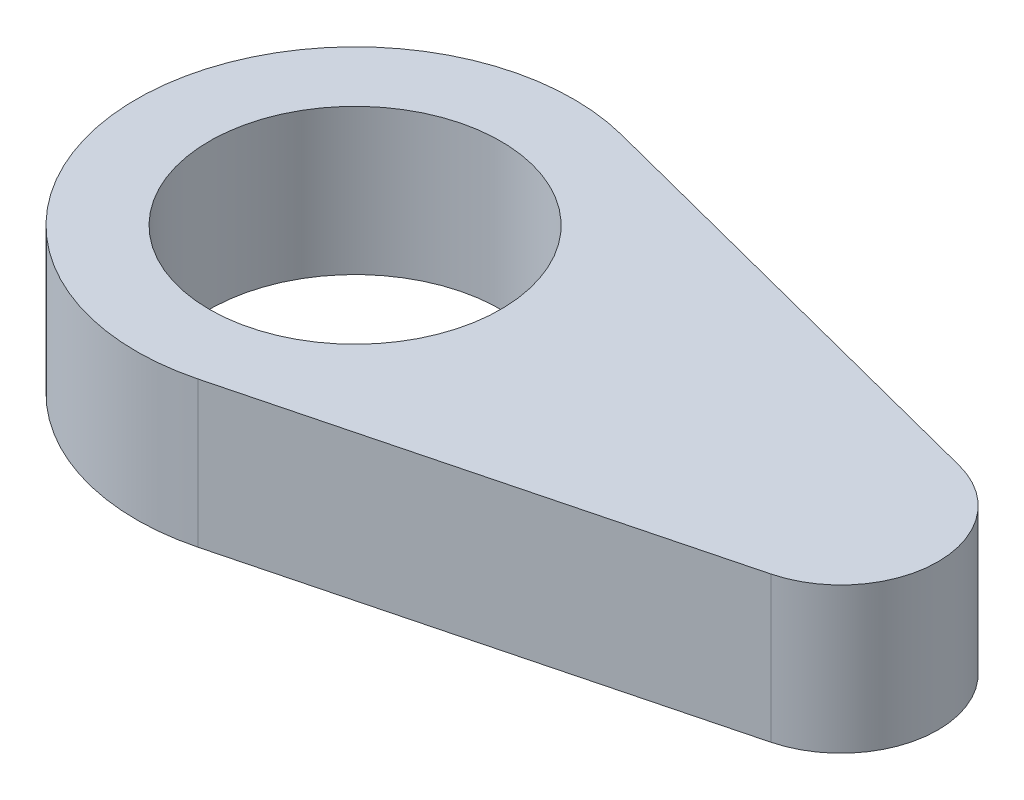
ISO-10303-21;
HEADER;
FILE_DESCRIPTION(('STEP AP214'),'2;1');
FILE_NAME('part.step','',(''),(''),'','','');
FILE_SCHEMA(('AUTOMOTIVE_DESIGN { 1 0 10303 214 1 1 1 1 }'));
ENDSEC;
DATA;
#1=APPLICATION_CONTEXT('core data for automotive mechanical design processes');
#2=APPLICATION_PROTOCOL_DEFINITION('international standard','automotive_design',2000,#1);
#3=PRODUCT_CONTEXT('',#1,'mechanical');
#4=PRODUCT('Part','Part','',(#3));
#5=PRODUCT_RELATED_PRODUCT_CATEGORY('part','',(#4));
#6=PRODUCT_DEFINITION_FORMATION('','',#4);
#7=PRODUCT_DEFINITION_CONTEXT('part definition',#1,'design');
#8=PRODUCT_DEFINITION('design','',#6,#7);
#9=PRODUCT_DEFINITION_SHAPE('','',#8);
#10=(LENGTH_UNIT() NAMED_UNIT(*) SI_UNIT(.MILLI.,.METRE.));
#11=(NAMED_UNIT(*) PLANE_ANGLE_UNIT() SI_UNIT($,.RADIAN.));
#12=(NAMED_UNIT(*) SI_UNIT($,.STERADIAN.) SOLID_ANGLE_UNIT());
#13=UNCERTAINTY_MEASURE_WITH_UNIT(LENGTH_MEASURE(1.E-05),#10,'distance_accuracy_value','');
#14=(GEOMETRIC_REPRESENTATION_CONTEXT(3) GLOBAL_UNCERTAINTY_ASSIGNED_CONTEXT((#13)) GLOBAL_UNIT_ASSIGNED_CONTEXT((#10,
#11,#12)) REPRESENTATION_CONTEXT('',''));
#15=CARTESIAN_POINT('',(0.,0.,0.));
#16=DIRECTION('',(0.,0.,1.));
#17=DIRECTION('',(1.,0.,0.));
#18=AXIS2_PLACEMENT_3D('',#15,#16,#17);
#19=CARTESIAN_POINT('',(0.,3.,0.));
#20=DIRECTION('',(0.,-1.,0.));
#21=DIRECTION('',(0.,0.,-1.));
#22=AXIS2_PLACEMENT_3D('',#19,#20,#21);
#23=CYLINDRICAL_SURFACE('',#22,4.5);
#24=CARTESIAN_POINT('',(0.,0.,0.));
#25=DIRECTION('',(0.,1.,0.));
#26=DIRECTION('',(0.,0.,1.));
#27=AXIS2_PLACEMENT_3D('',#24,#25,#26);
#28=CIRCLE('',#27,4.5);
#29=CARTESIAN_POINT('',(1.12500000069442,0.,-4.35710626430405));
#30=VERTEX_POINT('',#29);
#31=CARTESIAN_POINT('',(1.12499999930558,0.,4.35710626466264));
#32=VERTEX_POINT('',#31);
#33=EDGE_CURVE('E107',#30,#32,#28,.T.);
#34=ORIENTED_EDGE('',*,*,#33,.T.);
#35=DIRECTION('',(0.,-1.,0.));
#36=VECTOR('',#35,1.);
#37=CARTESIAN_POINT('',(1.12499999930558,3.,4.35710626466264));
#38=LINE('',#37,#36);
#39=CARTESIAN_POINT('',(1.12499999930558,3.,4.35710626466264));
#40=VERTEX_POINT('',#39);
#41=EDGE_CURVE('E11',#40,#32,#38,.T.);
#42=ORIENTED_EDGE('',*,*,#41,.F.);
#43=CARTESIAN_POINT('',(0.,3.,0.));
#44=DIRECTION('',(0.,1.,0.));
#45=DIRECTION('',(0.,0.,1.));
#46=AXIS2_PLACEMENT_3D('',#43,#44,#45);
#47=CIRCLE('',#46,4.5);
#48=CARTESIAN_POINT('',(1.12500000069442,3.,-4.35710626430405));
#49=VERTEX_POINT('',#48);
#50=EDGE_CURVE('E81',#49,#40,#47,.T.);
#51=ORIENTED_EDGE('',*,*,#50,.F.);
#52=DIRECTION('',(0.,-1.,0.));
#53=VECTOR('',#52,1.);
#54=CARTESIAN_POINT('',(1.12500000069442,3.,-4.35710626430405));
#55=LINE('',#54,#53);
#56=EDGE_CURVE('E103',#49,#30,#55,.T.);
#57=ORIENTED_EDGE('',*,*,#56,.T.);
#58=EDGE_LOOP('',(#34,#42,#51,#57));
#59=FACE_BOUND('',#58,.T.);
#60=ADVANCED_FACE('F38',(#59),#23,.T.);
#61=CARTESIAN_POINT('',(1.12499999930558,3.,4.35710626466264));
#62=DIRECTION('',(0.249999999845684,0.,0.968245836591698));
#63=DIRECTION('',(0.968245836591698,0.,-0.249999999845684));
#64=AXIS2_PLACEMENT_3D('',#61,#62,#63);
#65=PLANE('',#64);
#66=DIRECTION('',(-0.968245836591698,0.,0.249999999845684));
#67=VECTOR('',#66,1.);
#68=CARTESIAN_POINT('',(1.12499999930558,0.,4.35710626466264));
#69=LINE('',#68,#67);
#70=CARTESIAN_POINT('',(10.5000000003858,0.,1.93649167459786));
#71=VERTEX_POINT('',#70);
#72=EDGE_CURVE('E91',#71,#32,#69,.T.);
#73=ORIENTED_EDGE('',*,*,#72,.F.);
#74=DIRECTION('',(0.,-1.,0.));
#75=VECTOR('',#74,1.);
#76=CARTESIAN_POINT('',(10.5000000003858,3.,1.93649167459786));
#77=LINE('',#76,#75);
#78=CARTESIAN_POINT('',(10.5000000003858,3.,1.93649167459786));
#79=VERTEX_POINT('',#78);
#80=EDGE_CURVE('E47',#79,#71,#77,.T.);
#81=ORIENTED_EDGE('',*,*,#80,.F.);
#82=DIRECTION('',(-0.968245836591698,0.,0.249999999845684));
#83=VECTOR('',#82,1.);
#84=CARTESIAN_POINT('',(1.12499999930558,3.,4.35710626466264));
#85=LINE('',#84,#83);
#86=EDGE_CURVE('E89',#79,#40,#85,.T.);
#87=ORIENTED_EDGE('',*,*,#86,.T.);
#88=ORIENTED_EDGE('',*,*,#41,.T.);
#89=EDGE_LOOP('',(#73,#81,#87,#88));
#90=FACE_BOUND('',#89,.T.);
#91=ADVANCED_FACE('F88',(#90),#65,.T.);
#92=CARTESIAN_POINT('',(10.,3.,1.59376548417023E-09));
#93=DIRECTION('',(0.,-1.,0.));
#94=DIRECTION('',(0.,0.,-1.));
#95=AXIS2_PLACEMENT_3D('',#92,#93,#94);
#96=CYLINDRICAL_SURFACE('',#95,2.);
#97=CARTESIAN_POINT('',(10.,0.,1.59376548417023E-09));
#98=DIRECTION('',(0.,1.,0.));
#99=DIRECTION('',(0.,0.,1.));
#100=AXIS2_PLACEMENT_3D('',#97,#98,#99);
#101=CIRCLE('',#100,2.);
#102=CARTESIAN_POINT('',(10.5000000003086,0.,-1.93649167143025));
#103=VERTEX_POINT('',#102);
#104=EDGE_CURVE('E70',#71,#103,#101,.T.);
#105=ORIENTED_EDGE('',*,*,#104,.T.);
#106=DIRECTION('',(0.,-1.,0.));
#107=VECTOR('',#106,1.);
#108=CARTESIAN_POINT('',(10.5000000003086,3.,-1.93649167143025));
#109=LINE('',#108,#107);
#110=CARTESIAN_POINT('',(10.5000000003086,3.,-1.93649167143025));
#111=VERTEX_POINT('',#110);
#112=EDGE_CURVE('E92',#111,#103,#109,.T.);
#113=ORIENTED_EDGE('',*,*,#112,.F.);
#114=CARTESIAN_POINT('',(10.,3.,1.59376548417023E-09));
#115=DIRECTION('',(0.,1.,0.));
#116=DIRECTION('',(0.,0.,1.));
#117=AXIS2_PLACEMENT_3D('',#114,#115,#116);
#118=CIRCLE('',#117,2.);
#119=EDGE_CURVE('E93',#79,#111,#118,.T.);
#120=ORIENTED_EDGE('',*,*,#119,.F.);
#121=ORIENTED_EDGE('',*,*,#80,.T.);
#122=EDGE_LOOP('',(#105,#113,#120,#121));
#123=FACE_BOUND('',#122,.T.);
#124=ADVANCED_FACE('F94',(#123),#96,.T.);
#125=CARTESIAN_POINT('',(0.,3.,0.));
#126=DIRECTION('',(0.,-1.,0.));
#127=DIRECTION('',(0.,0.,-1.));
#128=AXIS2_PLACEMENT_3D('',#125,#126,#127);
#129=CYLINDRICAL_SURFACE('',#128,3.);
#130=CARTESIAN_POINT('',(0.,3.,0.));
#131=DIRECTION('',(0.,1.,0.));
#132=DIRECTION('',(0.,0.,1.));
#133=AXIS2_PLACEMENT_3D('',#130,#131,#132);
#134=CIRCLE('',#133,3.);
#135=CARTESIAN_POINT('',(0.,3.,3.));
#136=VERTEX_POINT('',#135);
#137=EDGE_CURVE('E98',#136,#136,#134,.T.);
#138=ORIENTED_EDGE('',*,*,#137,.T.);
#139=EDGE_LOOP('',(#138));
#140=FACE_BOUND('',#139,.T.);
#141=CARTESIAN_POINT('',(0.,0.,0.));
#142=DIRECTION('',(0.,1.,0.));
#143=DIRECTION('',(0.,0.,1.));
#144=AXIS2_PLACEMENT_3D('',#141,#142,#143);
#145=CIRCLE('',#144,3.);
#146=CARTESIAN_POINT('',(0.,0.,3.));
#147=VERTEX_POINT('',#146);
#148=EDGE_CURVE('E104',#147,#147,#145,.T.);
#149=ORIENTED_EDGE('',*,*,#148,.F.);
#150=EDGE_LOOP('',(#149));
#151=FACE_BOUND('',#150,.T.);
#152=ADVANCED_FACE('F40',(#140,#151),#129,.F.);
#153=CARTESIAN_POINT('',(1.12500000069442,3.,-4.35710626430405));
#154=DIRECTION('',(-0.250000000154316,0.,0.96824583651201));
#155=DIRECTION('',(0.96824583651201,0.,0.250000000154316));
#156=AXIS2_PLACEMENT_3D('',#153,#154,#155);
#157=PLANE('',#156);
#158=DIRECTION('',(-0.96824583651201,0.,-0.250000000154316));
#159=VECTOR('',#158,1.);
#160=CARTESIAN_POINT('',(1.12500000069442,0.,-4.35710626430405));
#161=LINE('',#160,#159);
#162=EDGE_CURVE('E76',#103,#30,#161,.T.);
#163=ORIENTED_EDGE('',*,*,#162,.T.);
#164=ORIENTED_EDGE('',*,*,#56,.F.);
#165=DIRECTION('',(-0.96824583651201,0.,-0.250000000154316));
#166=VECTOR('',#165,1.);
#167=CARTESIAN_POINT('',(1.12500000069442,3.,-4.35710626430405));
#168=LINE('',#167,#166);
#169=EDGE_CURVE('E55',#111,#49,#168,.T.);
#170=ORIENTED_EDGE('',*,*,#169,.F.);
#171=ORIENTED_EDGE('',*,*,#112,.T.);
#172=EDGE_LOOP('',(#163,#164,#170,#171));
#173=FACE_BOUND('',#172,.T.);
#174=ADVANCED_FACE('F114',(#173),#157,.F.);
#175=CARTESIAN_POINT('',(0.,3.,0.));
#176=DIRECTION('',(0.,1.,0.));
#177=DIRECTION('',(0.,0.,1.));
#178=AXIS2_PLACEMENT_3D('',#175,#176,#177);
#179=PLANE('',#178);
#180=ORIENTED_EDGE('',*,*,#137,.F.);
#181=EDGE_LOOP('',(#180));
#182=FACE_BOUND('',#181,.T.);
#183=ORIENTED_EDGE('',*,*,#50,.T.);
#184=ORIENTED_EDGE('',*,*,#86,.F.);
#185=ORIENTED_EDGE('',*,*,#119,.T.);
#186=ORIENTED_EDGE('',*,*,#169,.T.);
#187=EDGE_LOOP('',(#183,#184,#185,#186));
#188=FACE_BOUND('',#187,.T.);
#189=ADVANCED_FACE('F96',(#182,#188),#179,.T.);
#190=CARTESIAN_POINT('',(0.,0.,0.));
#191=DIRECTION('',(0.,1.,0.));
#192=DIRECTION('',(0.,0.,1.));
#193=AXIS2_PLACEMENT_3D('',#190,#191,#192);
#194=PLANE('',#193);
#195=ORIENTED_EDGE('',*,*,#148,.T.);
#196=EDGE_LOOP('',(#195));
#197=FACE_BOUND('',#196,.T.);
#198=ORIENTED_EDGE('',*,*,#33,.F.);
#199=ORIENTED_EDGE('',*,*,#162,.F.);
#200=ORIENTED_EDGE('',*,*,#104,.F.);
#201=ORIENTED_EDGE('',*,*,#72,.T.);
#202=EDGE_LOOP('',(#198,#199,#200,#201));
#203=FACE_BOUND('',#202,.T.);
#204=ADVANCED_FACE('F117',(#197,#203),#194,.F.);
#205=CLOSED_SHELL('',(#60,#91,#124,#152,#174,#189,#204));
#206=MANIFOLD_SOLID_BREP('B2',#205);
#207=ADVANCED_BREP_SHAPE_REPRESENTATION('',(#18,#206),#14);
#208=SHAPE_DEFINITION_REPRESENTATION(#9,#207);
ENDSEC;
END-ISO-10303-21;
